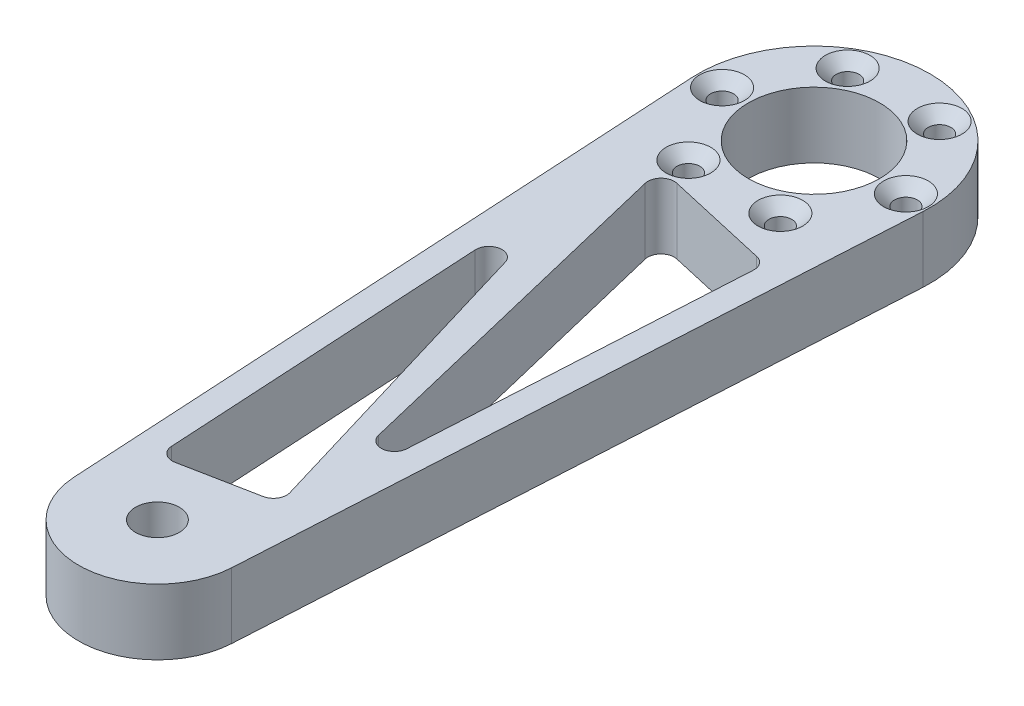
ISO-10303-21;
HEADER;
FILE_DESCRIPTION(('STEP AP214'),'2;1');
FILE_NAME('part.step','',(''),(''),'','','');
FILE_SCHEMA(('AUTOMOTIVE_DESIGN { 1 0 10303 214 1 1 1 1 }'));
ENDSEC;
DATA;
#1=APPLICATION_CONTEXT('core data for automotive mechanical design processes');
#2=APPLICATION_PROTOCOL_DEFINITION('international standard','automotive_design',2000,#1);
#3=PRODUCT_CONTEXT('',#1,'mechanical');
#4=PRODUCT('Part','Part','',(#3));
#5=PRODUCT_RELATED_PRODUCT_CATEGORY('part','',(#4));
#6=PRODUCT_DEFINITION_FORMATION('','',#4);
#7=PRODUCT_DEFINITION_CONTEXT('part definition',#1,'design');
#8=PRODUCT_DEFINITION('design','',#6,#7);
#9=PRODUCT_DEFINITION_SHAPE('','',#8);
#10=(LENGTH_UNIT() NAMED_UNIT(*) SI_UNIT(.MILLI.,.METRE.));
#11=(NAMED_UNIT(*) PLANE_ANGLE_UNIT() SI_UNIT($,.RADIAN.));
#12=(NAMED_UNIT(*) SI_UNIT($,.STERADIAN.) SOLID_ANGLE_UNIT());
#13=UNCERTAINTY_MEASURE_WITH_UNIT(LENGTH_MEASURE(1.E-05),#10,'distance_accuracy_value','');
#14=(GEOMETRIC_REPRESENTATION_CONTEXT(3) GLOBAL_UNCERTAINTY_ASSIGNED_CONTEXT((#13)) GLOBAL_UNIT_ASSIGNED_CONTEXT((#10,
#11,#12)) REPRESENTATION_CONTEXT('',''));
#15=CARTESIAN_POINT('',(0.,0.,0.));
#16=DIRECTION('',(0.,0.,1.));
#17=DIRECTION('',(1.,0.,0.));
#18=AXIS2_PLACEMENT_3D('',#15,#16,#17);
#19=CARTESIAN_POINT('',(0.,15.,0.));
#20=DIRECTION('',(0.,1.,0.));
#21=DIRECTION('',(0.,0.,1.));
#22=AXIS2_PLACEMENT_3D('',#19,#20,#21);
#23=PLANE('',#22);
#24=CARTESIAN_POINT('',(-21.,15.,-150.));
#25=DIRECTION('',(0.,1.,0.));
#26=DIRECTION('',(0.,0.,1.));
#27=AXIS2_PLACEMENT_3D('',#24,#25,#26);
#28=CIRCLE('',#27,5.10000000000002);
#29=CARTESIAN_POINT('',(-21.,15.,-144.9));
#30=VERTEX_POINT('',#29);
#31=EDGE_CURVE('E257',#30,#30,#28,.F.);
#32=ORIENTED_EDGE('',*,*,#31,.T.);
#33=EDGE_LOOP('',(#32));
#34=FACE_BOUND('',#33,.T.);
#35=CARTESIAN_POINT('',(-10.4999999999998,15.,-131.813466520527));
#36=DIRECTION('',(0.,1.,0.));
#37=DIRECTION('',(0.,0.,1.));
#38=AXIS2_PLACEMENT_3D('',#35,#36,#37);
#39=CIRCLE('',#38,5.10000000000005);
#40=CARTESIAN_POINT('',(-10.4999999999998,15.,-126.713466520527));
#41=VERTEX_POINT('',#40);
#42=EDGE_CURVE('E254',#41,#41,#39,.F.);
#43=ORIENTED_EDGE('',*,*,#42,.T.);
#44=EDGE_LOOP('',(#43));
#45=FACE_BOUND('',#44,.T.);
#46=CARTESIAN_POINT('',(10.5000000000001,15.,-131.813466520527));
#47=DIRECTION('',(0.,1.,0.));
#48=DIRECTION('',(0.,0.,1.));
#49=AXIS2_PLACEMENT_3D('',#46,#47,#48);
#50=CIRCLE('',#49,5.10000000000005);
#51=CARTESIAN_POINT('',(10.5000000000001,15.,-126.713466520527));
#52=VERTEX_POINT('',#51);
#53=EDGE_CURVE('E251',#52,#52,#50,.F.);
#54=ORIENTED_EDGE('',*,*,#53,.T.);
#55=EDGE_LOOP('',(#54));
#56=FACE_BOUND('',#55,.T.);
#57=CARTESIAN_POINT('',(21.,15.,-150.));
#58=DIRECTION('',(0.,1.,0.));
#59=DIRECTION('',(0.,0.,1.));
#60=AXIS2_PLACEMENT_3D('',#57,#58,#59);
#61=CIRCLE('',#60,5.10000000000002);
#62=CARTESIAN_POINT('',(21.,15.,-144.9));
#63=VERTEX_POINT('',#62);
#64=EDGE_CURVE('E248',#63,#63,#61,.F.);
#65=ORIENTED_EDGE('',*,*,#64,.T.);
#66=EDGE_LOOP('',(#65));
#67=FACE_BOUND('',#66,.T.);
#68=CARTESIAN_POINT('',(10.4999999999998,15.,-168.186533479473));
#69=DIRECTION('',(0.,1.,0.));
#70=DIRECTION('',(0.,0.,1.));
#71=AXIS2_PLACEMENT_3D('',#68,#69,#70);
#72=CIRCLE('',#71,5.10000000000005);
#73=CARTESIAN_POINT('',(10.4999999999998,15.,-163.086533479473));
#74=VERTEX_POINT('',#73);
#75=EDGE_CURVE('E245',#74,#74,#72,.F.);
#76=ORIENTED_EDGE('',*,*,#75,.T.);
#77=EDGE_LOOP('',(#76));
#78=FACE_BOUND('',#77,.T.);
#79=CARTESIAN_POINT('',(-10.5000000000001,15.,-168.186533479473));
#80=DIRECTION('',(0.,1.,0.));
#81=DIRECTION('',(0.,0.,1.));
#82=AXIS2_PLACEMENT_3D('',#79,#80,#81);
#83=CIRCLE('',#82,5.10000000000002);
#84=CARTESIAN_POINT('',(-10.5000000000001,15.,-163.086533479473));
#85=VERTEX_POINT('',#84);
#86=EDGE_CURVE('E242',#85,#85,#83,.F.);
#87=ORIENTED_EDGE('',*,*,#86,.T.);
#88=EDGE_LOOP('',(#87));
#89=FACE_BOUND('',#88,.T.);
#90=CARTESIAN_POINT('',(0.,15.,0.));
#91=DIRECTION('',(0.,1.,0.));
#92=DIRECTION('',(0.,0.,1.));
#93=AXIS2_PLACEMENT_3D('',#90,#91,#92);
#94=CIRCLE('',#93,5.);
#95=CARTESIAN_POINT('',(0.,15.,5.));
#96=VERTEX_POINT('',#95);
#97=EDGE_CURVE('E440',#96,#96,#94,.T.);
#98=ORIENTED_EDGE('',*,*,#97,.F.);
#99=EDGE_LOOP('',(#98));
#100=FACE_BOUND('',#99,.T.);
#101=CARTESIAN_POINT('',(0.,15.,0.));
#102=DIRECTION('',(0.,1.,0.));
#103=DIRECTION('',(0.,0.,1.));
#104=AXIS2_PLACEMENT_3D('',#101,#102,#103);
#105=CIRCLE('',#104,18.);
#106=CARTESIAN_POINT('',(-17.971076762398,15.,1.02));
#107=VERTEX_POINT('',#106);
#108=CARTESIAN_POINT('',(17.971076762398,15.,1.02));
#109=VERTEX_POINT('',#108);
#110=EDGE_CURVE('E168',#107,#109,#105,.T.);
#111=ORIENTED_EDGE('',*,*,#110,.T.);
#112=DIRECTION('',(0.0566666666666667,0.,-0.998393153466553));
#113=VECTOR('',#112,1.);
#114=CARTESIAN_POINT('',(17.971076762398,15.,1.02));
#115=LINE('',#114,#113);
#116=CARTESIAN_POINT('',(26.4574185668637,15.,-148.498333333333));
#117=VERTEX_POINT('',#116);
#118=EDGE_CURVE('E157',#109,#117,#115,.T.);
#119=ORIENTED_EDGE('',*,*,#118,.T.);
#120=CARTESIAN_POINT('',(0.,15.,-150.));
#121=DIRECTION('',(0.,1.,0.));
#122=DIRECTION('',(0.,0.,-1.));
#123=AXIS2_PLACEMENT_3D('',#120,#121,#122);
#124=CIRCLE('',#123,26.5);
#125=CARTESIAN_POINT('',(-26.4574185668637,15.,-148.498333333333));
#126=VERTEX_POINT('',#125);
#127=EDGE_CURVE('E167',#117,#126,#124,.T.);
#128=ORIENTED_EDGE('',*,*,#127,.T.);
#129=DIRECTION('',(0.0566666666666667,0.,0.998393153466553));
#130=VECTOR('',#129,1.);
#131=CARTESIAN_POINT('',(-17.971076762398,15.,1.02));
#132=LINE('',#131,#130);
#133=EDGE_CURVE('E173',#126,#107,#132,.T.);
#134=ORIENTED_EDGE('',*,*,#133,.T.);
#135=EDGE_LOOP('',(#111,#119,#128,#134));
#136=FACE_BOUND('',#135,.T.);
#137=CARTESIAN_POINT('',(0.,15.,-150.));
#138=DIRECTION('',(0.,1.,0.));
#139=DIRECTION('',(0.,0.,1.));
#140=AXIS2_PLACEMENT_3D('',#137,#138,#139);
#141=CIRCLE('',#140,15.);
#142=CARTESIAN_POINT('',(0.,15.,-135.));
#143=VERTEX_POINT('',#142);
#144=EDGE_CURVE('E434',#143,#143,#141,.T.);
#145=ORIENTED_EDGE('',*,*,#144,.F.);
#146=EDGE_LOOP('',(#145));
#147=FACE_BOUND('',#146,.T.);
#148=DIRECTION('',(-0.286666756449605,0.,-0.958030360033889));
#149=VECTOR('',#148,1.);
#150=CARTESIAN_POINT('',(-18.5543851913669,15.,-115.139490738387));
#151=LINE('',#150,#149);
#152=CARTESIAN_POINT('',(9.76560528215196,15.,-20.4950645568282));
#153=VERTEX_POINT('',#152);
#154=CARTESIAN_POINT('',(-11.2390630531947,15.,-90.6919378076061));
#155=VERTEX_POINT('',#154);
#156=EDGE_CURVE('E419',#153,#155,#151,.T.);
#157=ORIENTED_EDGE('',*,*,#156,.F.);
#158=CARTESIAN_POINT('',(6.8915142020503,15.,-19.6350642874794));
#159=DIRECTION('',(0.,1.,0.));
#160=DIRECTION('',(0.,0.,1.));
#161=AXIS2_PLACEMENT_3D('',#158,#159,#160);
#162=CIRCLE('',#161,3.);
#163=CARTESIAN_POINT('',(7.47066200637673,15.,-16.6914970943031));
#164=VERTEX_POINT('',#163);
#165=EDGE_CURVE('E57',#153,#164,#162,.F.);
#166=ORIENTED_EDGE('',*,*,#165,.T.);
#167=DIRECTION('',(0.981189064392104,0.,-0.19304926810881));
#168=VECTOR('',#167,1.);
#169=CARTESIAN_POINT('',(10.7128519545465,15.,-17.3293990229714));
#170=LINE('',#169,#168);
#171=CARTESIAN_POINT('',(-9.3618110753663,15.,-13.3797025311371));
#172=VERTEX_POINT('',#171);
#173=EDGE_CURVE('E417',#172,#164,#170,.T.);
#174=ORIENTED_EDGE('',*,*,#173,.F.);
#175=CARTESIAN_POINT('',(-9.94095887969273,15.,-16.3232697243134));
#176=DIRECTION('',(0.,1.,0.));
#177=DIRECTION('',(0.,0.,1.));
#178=AXIS2_PLACEMENT_3D('',#175,#176,#177);
#179=CIRCLE('',#178,3.);
#180=CARTESIAN_POINT('',(-12.9361383400924,15.,-16.1532697243134));
#181=VERTEX_POINT('',#180);
#182=EDGE_CURVE('E230',#172,#181,#179,.F.);
#183=ORIENTED_EDGE('',*,*,#182,.T.);
#184=DIRECTION('',(0.0566666666666666,0.,0.998393153466553));
#185=VECTOR('',#184,1.);
#186=CARTESIAN_POINT('',(-12.7409809539486,15.,-12.7148497565296));
#187=LINE('',#186,#185);
#188=CARTESIAN_POINT('',(-17.108333593696,15.,-89.6619375382572));
#189=VERTEX_POINT('',#188);
#190=EDGE_CURVE('E423',#189,#181,#187,.T.);
#191=ORIENTED_EDGE('',*,*,#190,.F.);
#192=CARTESIAN_POINT('',(-14.1131541332963,15.,-89.8319375382572));
#193=DIRECTION('',(0.,1.,0.));
#194=DIRECTION('',(0.,0.,1.));
#195=AXIS2_PLACEMENT_3D('',#192,#193,#194);
#196=CIRCLE('',#195,3.);
#197=EDGE_CURVE('E226',#189,#155,#196,.F.);
#198=ORIENTED_EDGE('',*,*,#197,.T.);
#199=EDGE_LOOP('',(#157,#166,#174,#183,#191,#198));
#200=FACE_BOUND('',#199,.T.);
#201=DIRECTION('',(0.234668209936248,0.,0.972075527541619));
#202=VECTOR('',#201,1.);
#203=CARTESIAN_POINT('',(-12.,15.,-127.));
#204=LINE('',#203,#202);
#205=CARTESIAN_POINT('',(-10.8653488920019,15.,-122.299889257763));
#206=VERTEX_POINT('',#205);
#207=CARTESIAN_POINT('',(8.52161939319863,15.,-41.992473829023));
#208=VERTEX_POINT('',#207);
#209=EDGE_CURVE('E402',#206,#208,#204,.T.);
#210=ORIENTED_EDGE('',*,*,#209,.F.);
#211=CARTESIAN_POINT('',(-7.94912230937701,15.,-123.003893887571));
#212=DIRECTION('',(0.,1.,0.));
#213=DIRECTION('',(0.,0.,1.));
#214=AXIS2_PLACEMENT_3D('',#211,#212,#213);
#215=CIRCLE('',#214,3.);
#216=CARTESIAN_POINT('',(-7.28487950298156,15.,-125.929433409463));
#217=VERTEX_POINT('',#216);
#218=EDGE_CURVE('E222',#206,#217,#215,.F.);
#219=ORIENTED_EDGE('',*,*,#218,.T.);
#220=DIRECTION('',(-0.975179840630658,0.,-0.221414268798477));
#221=VECTOR('',#220,1.);
#222=CARTESIAN_POINT('',(18.8302573337206,15.,-120.));
#223=LINE('',#222,#221);
#224=CARTESIAN_POINT('',(16.3555160897141,15.,-120.561889202563));
#225=VERTEX_POINT('',#224);
#226=EDGE_CURVE('E399',#225,#217,#223,.T.);
#227=ORIENTED_EDGE('',*,*,#226,.F.);
#228=CARTESIAN_POINT('',(15.6912732833187,15.,-117.636349680671));
#229=DIRECTION('',(0.,1.,0.));
#230=DIRECTION('',(0.,0.,1.));
#231=AXIS2_PLACEMENT_3D('',#228,#229,#230);
#232=CIRCLE('',#231,3.);
#233=CARTESIAN_POINT('',(18.6864527437183,15.,-117.466349680671));
#234=VERTEX_POINT('',#233);
#235=EDGE_CURVE('E218',#225,#234,#232,.F.);
#236=ORIENTED_EDGE('',*,*,#235,.T.);
#237=DIRECTION('',(0.0566666666666667,0.,-0.998393153466553));
#238=VECTOR('',#237,1.);
#239=CARTESIAN_POINT('',(13.2832157063432,15.,-22.2683226570439));
#240=LINE('',#239,#238);
#241=CARTESIAN_POINT('',(14.4330254362231,15.,-42.5264784588318));
#242=VERTEX_POINT('',#241);
#243=EDGE_CURVE('E406',#242,#234,#240,.T.);
#244=ORIENTED_EDGE('',*,*,#243,.F.);
#245=CARTESIAN_POINT('',(11.4378459758235,15.,-42.6964784588318));
#246=DIRECTION('',(0.,1.,0.));
#247=DIRECTION('',(0.,0.,1.));
#248=AXIS2_PLACEMENT_3D('',#245,#246,#247);
#249=CIRCLE('',#248,3.);
#250=EDGE_CURVE('E234',#242,#208,#249,.F.);
#251=ORIENTED_EDGE('',*,*,#250,.T.);
#252=EDGE_LOOP('',(#210,#219,#227,#236,#244,#251));
#253=FACE_BOUND('',#252,.T.);
#254=ADVANCED_FACE('F41',(#34,#45,#56,#67,#78,#89,#100,#136,#147,#200,#253),#23,.T.);
#255=CARTESIAN_POINT('',(0.,0.,0.));
#256=DIRECTION('',(0.,1.,0.));
#257=DIRECTION('',(0.,0.,1.));
#258=AXIS2_PLACEMENT_3D('',#255,#256,#257);
#259=PLANE('',#258);
#260=CARTESIAN_POINT('',(-10.5000000000001,0.,-168.186533479473));
#261=DIRECTION('',(0.,1.,0.));
#262=DIRECTION('',(0.866025403784436,0.,-0.500000000000004));
#263=AXIS2_PLACEMENT_3D('',#260,#261,#262);
#264=CIRCLE('',#263,2.6);
#265=CARTESIAN_POINT('',(-8.24833395016056,0.,-169.486533479473));
#266=VERTEX_POINT('',#265);
#267=EDGE_CURVE('E390',#266,#266,#264,.T.);
#268=ORIENTED_EDGE('',*,*,#267,.T.);
#269=EDGE_LOOP('',(#268));
#270=FACE_BOUND('',#269,.T.);
#271=CARTESIAN_POINT('',(-10.4999999999998,0.,-131.813466520527));
#272=DIRECTION('',(0.,1.,0.));
#273=DIRECTION('',(-0.866025403784443,0.,-0.499999999999992));
#274=AXIS2_PLACEMENT_3D('',#271,#272,#273);
#275=CIRCLE('',#274,2.6);
#276=CARTESIAN_POINT('',(-12.7516660498394,0.,-133.113466520527));
#277=VERTEX_POINT('',#276);
#278=EDGE_CURVE('E393',#277,#277,#275,.T.);
#279=ORIENTED_EDGE('',*,*,#278,.T.);
#280=EDGE_LOOP('',(#279));
#281=FACE_BOUND('',#280,.T.);
#282=CARTESIAN_POINT('',(10.5000000000001,0.,-131.813466520527));
#283=DIRECTION('',(0.,1.,0.));
#284=DIRECTION('',(0.866025403784436,0.,-0.500000000000004));
#285=AXIS2_PLACEMENT_3D('',#282,#283,#284);
#286=CIRCLE('',#285,2.6);
#287=CARTESIAN_POINT('',(12.7516660498396,0.,-133.113466520527));
#288=VERTEX_POINT('',#287);
#289=EDGE_CURVE('E381',#288,#288,#286,.T.);
#290=ORIENTED_EDGE('',*,*,#289,.T.);
#291=EDGE_LOOP('',(#290));
#292=FACE_BOUND('',#291,.T.);
#293=CARTESIAN_POINT('',(10.4999999999998,0.,-168.186533479473));
#294=DIRECTION('',(0.,1.,0.));
#295=DIRECTION('',(-0.866025403784443,0.,-0.499999999999992));
#296=AXIS2_PLACEMENT_3D('',#293,#294,#295);
#297=CIRCLE('',#296,2.6);
#298=CARTESIAN_POINT('',(8.24833395016029,0.,-169.486533479473));
#299=VERTEX_POINT('',#298);
#300=EDGE_CURVE('E384',#299,#299,#297,.T.);
#301=ORIENTED_EDGE('',*,*,#300,.T.);
#302=EDGE_LOOP('',(#301));
#303=FACE_BOUND('',#302,.T.);
#304=CARTESIAN_POINT('',(-21.,0.,-150.));
#305=DIRECTION('',(0.,1.,0.));
#306=DIRECTION('',(0.,0.,1.));
#307=AXIS2_PLACEMENT_3D('',#304,#305,#306);
#308=CIRCLE('',#307,2.6);
#309=CARTESIAN_POINT('',(-21.,0.,-147.4));
#310=VERTEX_POINT('',#309);
#311=EDGE_CURVE('E387',#310,#310,#308,.T.);
#312=ORIENTED_EDGE('',*,*,#311,.T.);
#313=EDGE_LOOP('',(#312));
#314=FACE_BOUND('',#313,.T.);
#315=CARTESIAN_POINT('',(21.,0.,-150.));
#316=DIRECTION('',(0.,1.,0.));
#317=DIRECTION('',(0.,0.,1.));
#318=AXIS2_PLACEMENT_3D('',#315,#316,#317);
#319=CIRCLE('',#318,2.6);
#320=CARTESIAN_POINT('',(21.,0.,-147.4));
#321=VERTEX_POINT('',#320);
#322=EDGE_CURVE('E383',#321,#321,#319,.T.);
#323=ORIENTED_EDGE('',*,*,#322,.T.);
#324=EDGE_LOOP('',(#323));
#325=FACE_BOUND('',#324,.T.);
#326=DIRECTION('',(0.0566666666666666,0.,0.998393153466553));
#327=VECTOR('',#326,1.);
#328=CARTESIAN_POINT('',(-12.7409809539486,0.,-12.7148497565296));
#329=LINE('',#328,#327);
#330=CARTESIAN_POINT('',(-17.108333593696,0.,-89.6619375382572));
#331=VERTEX_POINT('',#330);
#332=CARTESIAN_POINT('',(-12.9361383400924,0.,-16.1532697243134));
#333=VERTEX_POINT('',#332);
#334=EDGE_CURVE('E420',#331,#333,#329,.T.);
#335=ORIENTED_EDGE('',*,*,#334,.T.);
#336=CARTESIAN_POINT('',(-9.94095887969273,0.,-16.3232697243134));
#337=DIRECTION('',(0.,1.,0.));
#338=DIRECTION('',(0.,0.,1.));
#339=AXIS2_PLACEMENT_3D('',#336,#337,#338);
#340=CIRCLE('',#339,3.);
#341=CARTESIAN_POINT('',(-9.3618110753663,0.,-13.3797025311371));
#342=VERTEX_POINT('',#341);
#343=EDGE_CURVE('E228',#333,#342,#340,.T.);
#344=ORIENTED_EDGE('',*,*,#343,.T.);
#345=DIRECTION('',(0.981189064392104,0.,-0.19304926810881));
#346=VECTOR('',#345,1.);
#347=CARTESIAN_POINT('',(10.7128519545465,0.,-17.3293990229714));
#348=LINE('',#347,#346);
#349=CARTESIAN_POINT('',(7.47066200637673,0.,-16.6914970943031));
#350=VERTEX_POINT('',#349);
#351=EDGE_CURVE('E409',#342,#350,#348,.T.);
#352=ORIENTED_EDGE('',*,*,#351,.T.);
#353=CARTESIAN_POINT('',(6.8915142020503,0.,-19.6350642874794));
#354=DIRECTION('',(0.,1.,0.));
#355=DIRECTION('',(0.,0.,1.));
#356=AXIS2_PLACEMENT_3D('',#353,#354,#355);
#357=CIRCLE('',#356,3.);
#358=CARTESIAN_POINT('',(9.76560528215196,0.,-20.4950645568282));
#359=VERTEX_POINT('',#358);
#360=EDGE_CURVE('E236',#350,#359,#357,.T.);
#361=ORIENTED_EDGE('',*,*,#360,.T.);
#362=DIRECTION('',(-0.286666756449605,0.,-0.958030360033889));
#363=VECTOR('',#362,1.);
#364=CARTESIAN_POINT('',(-18.5543851913669,0.,-115.139490738387));
#365=LINE('',#364,#363);
#366=CARTESIAN_POINT('',(-11.2390630531947,0.,-90.6919378076061));
#367=VERTEX_POINT('',#366);
#368=EDGE_CURVE('E429',#359,#367,#365,.T.);
#369=ORIENTED_EDGE('',*,*,#368,.T.);
#370=CARTESIAN_POINT('',(-14.1131541332963,0.,-89.8319375382572));
#371=DIRECTION('',(0.,1.,0.));
#372=DIRECTION('',(0.,0.,1.));
#373=AXIS2_PLACEMENT_3D('',#370,#371,#372);
#374=CIRCLE('',#373,3.);
#375=EDGE_CURVE('E224',#367,#331,#374,.T.);
#376=ORIENTED_EDGE('',*,*,#375,.T.);
#377=EDGE_LOOP('',(#335,#344,#352,#361,#369,#376));
#378=FACE_BOUND('',#377,.T.);
#379=CARTESIAN_POINT('',(0.,0.,0.));
#380=DIRECTION('',(0.,1.,0.));
#381=DIRECTION('',(0.,0.,1.));
#382=AXIS2_PLACEMENT_3D('',#379,#380,#381);
#383=CIRCLE('',#382,18.);
#384=CARTESIAN_POINT('',(-17.971076762398,0.,1.02));
#385=VERTEX_POINT('',#384);
#386=CARTESIAN_POINT('',(17.971076762398,0.,1.02));
#387=VERTEX_POINT('',#386);
#388=EDGE_CURVE('E181',#385,#387,#383,.T.);
#389=ORIENTED_EDGE('',*,*,#388,.F.);
#390=DIRECTION('',(0.0566666666666667,0.,0.998393153466553));
#391=VECTOR('',#390,1.);
#392=CARTESIAN_POINT('',(-17.971076762398,0.,1.02));
#393=LINE('',#392,#391);
#394=CARTESIAN_POINT('',(-26.4574185668637,0.,-148.498333333333));
#395=VERTEX_POINT('',#394);
#396=EDGE_CURVE('E177',#395,#385,#393,.T.);
#397=ORIENTED_EDGE('',*,*,#396,.F.);
#398=CARTESIAN_POINT('',(0.,0.,-150.));
#399=DIRECTION('',(0.,1.,0.));
#400=DIRECTION('',(0.,0.,-1.));
#401=AXIS2_PLACEMENT_3D('',#398,#399,#400);
#402=CIRCLE('',#401,26.5);
#403=CARTESIAN_POINT('',(26.4574185668637,0.,-148.498333333333));
#404=VERTEX_POINT('',#403);
#405=EDGE_CURVE('E451',#404,#395,#402,.T.);
#406=ORIENTED_EDGE('',*,*,#405,.F.);
#407=DIRECTION('',(0.0566666666666667,0.,-0.998393153466553));
#408=VECTOR('',#407,1.);
#409=CARTESIAN_POINT('',(17.971076762398,0.,1.02));
#410=LINE('',#409,#408);
#411=EDGE_CURVE('E449',#387,#404,#410,.T.);
#412=ORIENTED_EDGE('',*,*,#411,.F.);
#413=EDGE_LOOP('',(#389,#397,#406,#412));
#414=FACE_BOUND('',#413,.T.);
#415=CARTESIAN_POINT('',(0.,0.,0.));
#416=DIRECTION('',(0.,1.,0.));
#417=DIRECTION('',(0.,0.,1.));
#418=AXIS2_PLACEMENT_3D('',#415,#416,#417);
#419=CIRCLE('',#418,5.);
#420=CARTESIAN_POINT('',(0.,0.,5.));
#421=VERTEX_POINT('',#420);
#422=EDGE_CURVE('E437',#421,#421,#419,.T.);
#423=ORIENTED_EDGE('',*,*,#422,.T.);
#424=EDGE_LOOP('',(#423));
#425=FACE_BOUND('',#424,.T.);
#426=CARTESIAN_POINT('',(0.,0.,-150.));
#427=DIRECTION('',(0.,1.,0.));
#428=DIRECTION('',(0.,0.,1.));
#429=AXIS2_PLACEMENT_3D('',#426,#427,#428);
#430=CIRCLE('',#429,15.);
#431=CARTESIAN_POINT('',(0.,0.,-135.));
#432=VERTEX_POINT('',#431);
#433=EDGE_CURVE('E426',#432,#432,#430,.T.);
#434=ORIENTED_EDGE('',*,*,#433,.T.);
#435=EDGE_LOOP('',(#434));
#436=FACE_BOUND('',#435,.T.);
#437=DIRECTION('',(0.0566666666666667,0.,-0.998393153466553));
#438=VECTOR('',#437,1.);
#439=CARTESIAN_POINT('',(13.2832157063432,0.,-22.2683226570439));
#440=LINE('',#439,#438);
#441=CARTESIAN_POINT('',(14.4330254362231,0.,-42.5264784588318));
#442=VERTEX_POINT('',#441);
#443=CARTESIAN_POINT('',(18.6864527437183,0.,-117.466349680671));
#444=VERTEX_POINT('',#443);
#445=EDGE_CURVE('E403',#442,#444,#440,.T.);
#446=ORIENTED_EDGE('',*,*,#445,.T.);
#447=CARTESIAN_POINT('',(15.6912732833187,0.,-117.636349680671));
#448=DIRECTION('',(0.,1.,0.));
#449=DIRECTION('',(0.,0.,1.));
#450=AXIS2_PLACEMENT_3D('',#447,#448,#449);
#451=CIRCLE('',#450,3.);
#452=CARTESIAN_POINT('',(16.3555160897141,0.,-120.561889202563));
#453=VERTEX_POINT('',#452);
#454=EDGE_CURVE('E216',#444,#453,#451,.T.);
#455=ORIENTED_EDGE('',*,*,#454,.T.);
#456=DIRECTION('',(-0.975179840630658,0.,-0.221414268798477));
#457=VECTOR('',#456,1.);
#458=CARTESIAN_POINT('',(18.8302573337206,0.,-120.));
#459=LINE('',#458,#457);
#460=CARTESIAN_POINT('',(-7.28487950298156,0.,-125.929433409463));
#461=VERTEX_POINT('',#460);
#462=EDGE_CURVE('E397',#453,#461,#459,.T.);
#463=ORIENTED_EDGE('',*,*,#462,.T.);
#464=CARTESIAN_POINT('',(-7.94912230937701,0.,-123.003893887571));
#465=DIRECTION('',(0.,1.,0.));
#466=DIRECTION('',(0.,0.,1.));
#467=AXIS2_PLACEMENT_3D('',#464,#465,#466);
#468=CIRCLE('',#467,3.);
#469=CARTESIAN_POINT('',(-10.8653488920019,0.,-122.299889257763));
#470=VERTEX_POINT('',#469);
#471=EDGE_CURVE('E220',#461,#470,#468,.T.);
#472=ORIENTED_EDGE('',*,*,#471,.T.);
#473=DIRECTION('',(0.234668209936248,0.,0.972075527541619));
#474=VECTOR('',#473,1.);
#475=CARTESIAN_POINT('',(-12.,0.,-127.));
#476=LINE('',#475,#474);
#477=CARTESIAN_POINT('',(8.52161939319863,0.,-41.992473829023));
#478=VERTEX_POINT('',#477);
#479=EDGE_CURVE('E412',#470,#478,#476,.T.);
#480=ORIENTED_EDGE('',*,*,#479,.T.);
#481=CARTESIAN_POINT('',(11.4378459758235,0.,-42.6964784588318));
#482=DIRECTION('',(0.,1.,0.));
#483=DIRECTION('',(0.,0.,1.));
#484=AXIS2_PLACEMENT_3D('',#481,#482,#483);
#485=CIRCLE('',#484,3.);
#486=EDGE_CURVE('E232',#478,#442,#485,.T.);
#487=ORIENTED_EDGE('',*,*,#486,.T.);
#488=EDGE_LOOP('',(#446,#455,#463,#472,#480,#487));
#489=FACE_BOUND('',#488,.T.);
#490=ADVANCED_FACE('F289',(#270,#281,#292,#303,#314,#325,#378,#414,#425,#436,#489),#259,.F.);
#491=CARTESIAN_POINT('',(0.,15.,0.));
#492=DIRECTION('',(0.,-1.,0.));
#493=DIRECTION('',(0.,0.,-1.));
#494=AXIS2_PLACEMENT_3D('',#491,#492,#493);
#495=CYLINDRICAL_SURFACE('',#494,18.);
#496=ORIENTED_EDGE('',*,*,#388,.T.);
#497=DIRECTION('',(0.,-1.,0.));
#498=VECTOR('',#497,1.);
#499=CARTESIAN_POINT('',(17.971076762398,15.,1.02));
#500=LINE('',#499,#498);
#501=EDGE_CURVE('E161',#109,#387,#500,.T.);
#502=ORIENTED_EDGE('',*,*,#501,.F.);
#503=ORIENTED_EDGE('',*,*,#110,.F.);
#504=DIRECTION('',(0.,-1.,0.));
#505=VECTOR('',#504,1.);
#506=CARTESIAN_POINT('',(-17.971076762398,15.,1.02));
#507=LINE('',#506,#505);
#508=EDGE_CURVE('E447',#107,#385,#507,.T.);
#509=ORIENTED_EDGE('',*,*,#508,.T.);
#510=EDGE_LOOP('',(#496,#502,#503,#509));
#511=FACE_BOUND('',#510,.T.);
#512=ADVANCED_FACE('F179',(#511),#495,.T.);
#513=CARTESIAN_POINT('',(17.971076762398,15.,1.02));
#514=DIRECTION('',(-0.998393153466554,0.,-0.0566666666666667));
#515=DIRECTION('',(-0.0566666666666667,0.,0.998393153466554));
#516=AXIS2_PLACEMENT_3D('',#513,#514,#515);
#517=PLANE('',#516);
#518=ORIENTED_EDGE('',*,*,#411,.T.);
#519=DIRECTION('',(0.,-1.,0.));
#520=VECTOR('',#519,1.);
#521=CARTESIAN_POINT('',(26.4574185668637,15.,-148.498333333333));
#522=LINE('',#521,#520);
#523=EDGE_CURVE('E164',#117,#404,#522,.T.);
#524=ORIENTED_EDGE('',*,*,#523,.F.);
#525=ORIENTED_EDGE('',*,*,#118,.F.);
#526=ORIENTED_EDGE('',*,*,#501,.T.);
#527=EDGE_LOOP('',(#518,#524,#525,#526));
#528=FACE_BOUND('',#527,.T.);
#529=ADVANCED_FACE('F159',(#528),#517,.F.);
#530=CARTESIAN_POINT('',(0.,15.,-150.));
#531=DIRECTION('',(0.,-1.,0.));
#532=DIRECTION('',(0.,0.,-1.));
#533=AXIS2_PLACEMENT_3D('',#530,#531,#532);
#534=CYLINDRICAL_SURFACE('',#533,26.5);
#535=ORIENTED_EDGE('',*,*,#405,.T.);
#536=DIRECTION('',(0.,-1.,0.));
#537=VECTOR('',#536,1.);
#538=CARTESIAN_POINT('',(-26.4574185668637,15.,-148.498333333333));
#539=LINE('',#538,#537);
#540=EDGE_CURVE('E186',#126,#395,#539,.T.);
#541=ORIENTED_EDGE('',*,*,#540,.F.);
#542=ORIENTED_EDGE('',*,*,#127,.F.);
#543=ORIENTED_EDGE('',*,*,#523,.T.);
#544=EDGE_LOOP('',(#535,#541,#542,#543));
#545=FACE_BOUND('',#544,.T.);
#546=ADVANCED_FACE('F306',(#545),#534,.T.);
#547=CARTESIAN_POINT('',(-17.971076762398,15.,1.02));
#548=DIRECTION('',(0.998393153466554,0.,-0.0566666666666667));
#549=DIRECTION('',(-0.0566666666666667,0.,-0.998393153466554));
#550=AXIS2_PLACEMENT_3D('',#547,#548,#549);
#551=PLANE('',#550);
#552=ORIENTED_EDGE('',*,*,#396,.T.);
#553=ORIENTED_EDGE('',*,*,#508,.F.);
#554=ORIENTED_EDGE('',*,*,#133,.F.);
#555=ORIENTED_EDGE('',*,*,#540,.T.);
#556=EDGE_LOOP('',(#552,#553,#554,#555));
#557=FACE_BOUND('',#556,.T.);
#558=ADVANCED_FACE('F303',(#557),#551,.F.);
#559=CARTESIAN_POINT('',(0.,15.,0.));
#560=DIRECTION('',(0.,-1.,0.));
#561=DIRECTION('',(0.,0.,-1.));
#562=AXIS2_PLACEMENT_3D('',#559,#560,#561);
#563=CYLINDRICAL_SURFACE('',#562,5.);
#564=ORIENTED_EDGE('',*,*,#97,.T.);
#565=EDGE_LOOP('',(#564));
#566=FACE_BOUND('',#565,.T.);
#567=ORIENTED_EDGE('',*,*,#422,.F.);
#568=EDGE_LOOP('',(#567));
#569=FACE_BOUND('',#568,.T.);
#570=ADVANCED_FACE('F300',(#566,#569),#563,.F.);
#571=CARTESIAN_POINT('',(0.,15.,-150.));
#572=DIRECTION('',(0.,-1.,0.));
#573=DIRECTION('',(0.,0.,-1.));
#574=AXIS2_PLACEMENT_3D('',#571,#572,#573);
#575=CYLINDRICAL_SURFACE('',#574,15.);
#576=ORIENTED_EDGE('',*,*,#144,.T.);
#577=EDGE_LOOP('',(#576));
#578=FACE_BOUND('',#577,.T.);
#579=ORIENTED_EDGE('',*,*,#433,.F.);
#580=EDGE_LOOP('',(#579));
#581=FACE_BOUND('',#580,.T.);
#582=ADVANCED_FACE('F503',(#578,#581),#575,.F.);
#583=CARTESIAN_POINT('',(10.7128519545465,15.,-17.3293990229714));
#584=DIRECTION('',(-0.19304926810881,0.,-0.981189064392104));
#585=DIRECTION('',(-0.981189064392104,0.,0.19304926810881));
#586=AXIS2_PLACEMENT_3D('',#583,#584,#585);
#587=PLANE('',#586);
#588=ORIENTED_EDGE('',*,*,#351,.F.);
#589=DIRECTION('',(0.,-1.,0.));
#590=VECTOR('',#589,1.);
#591=CARTESIAN_POINT('',(-9.3618110753663,15.,-13.3797025311371));
#592=LINE('',#591,#590);
#593=EDGE_CURVE('E64',#342,#172,#592,.F.);
#594=ORIENTED_EDGE('',*,*,#593,.T.);
#595=ORIENTED_EDGE('',*,*,#173,.T.);
#596=DIRECTION('',(0.,-1.,0.));
#597=VECTOR('',#596,1.);
#598=CARTESIAN_POINT('',(7.47066200637673,0.,-16.6914970943031));
#599=LINE('',#598,#597);
#600=EDGE_CURVE('E212',#164,#350,#599,.T.);
#601=ORIENTED_EDGE('',*,*,#600,.T.);
#602=EDGE_LOOP('',(#588,#594,#595,#601));
#603=FACE_BOUND('',#602,.T.);
#604=ADVANCED_FACE('F500',(#603),#587,.T.);
#605=CARTESIAN_POINT('',(-18.5543851913669,15.,-115.139490738387));
#606=DIRECTION('',(-0.958030360033889,0.,0.286666756449605));
#607=DIRECTION('',(0.286666756449605,0.,0.958030360033889));
#608=AXIS2_PLACEMENT_3D('',#605,#606,#607);
#609=PLANE('',#608);
#610=ORIENTED_EDGE('',*,*,#156,.T.);
#611=DIRECTION('',(0.,-1.,0.));
#612=VECTOR('',#611,1.);
#613=CARTESIAN_POINT('',(-11.2390630531947,0.,-90.6919378076061));
#614=LINE('',#613,#612);
#615=EDGE_CURVE('E204',#155,#367,#614,.T.);
#616=ORIENTED_EDGE('',*,*,#615,.T.);
#617=ORIENTED_EDGE('',*,*,#368,.F.);
#618=DIRECTION('',(0.,-1.,0.));
#619=VECTOR('',#618,1.);
#620=CARTESIAN_POINT('',(9.76560528215196,15.,-20.4950645568282));
#621=LINE('',#620,#619);
#622=EDGE_CURVE('E202',#359,#153,#621,.F.);
#623=ORIENTED_EDGE('',*,*,#622,.T.);
#624=EDGE_LOOP('',(#610,#616,#617,#623));
#625=FACE_BOUND('',#624,.T.);
#626=ADVANCED_FACE('F493',(#625),#609,.T.);
#627=CARTESIAN_POINT('',(-12.7409809539486,15.,-12.7148497565296));
#628=DIRECTION('',(0.998393153466553,0.,-0.0566666666666666));
#629=DIRECTION('',(-0.0566666666666666,0.,-0.998393153466553));
#630=AXIS2_PLACEMENT_3D('',#627,#628,#629);
#631=PLANE('',#630);
#632=ORIENTED_EDGE('',*,*,#334,.F.);
#633=DIRECTION('',(0.,-1.,0.));
#634=VECTOR('',#633,1.);
#635=CARTESIAN_POINT('',(-17.108333593696,15.,-89.6619375382572));
#636=LINE('',#635,#634);
#637=EDGE_CURVE('E210',#331,#189,#636,.F.);
#638=ORIENTED_EDGE('',*,*,#637,.T.);
#639=ORIENTED_EDGE('',*,*,#190,.T.);
#640=DIRECTION('',(0.,-1.,0.));
#641=VECTOR('',#640,1.);
#642=CARTESIAN_POINT('',(-12.9361383400924,0.,-16.1532697243134));
#643=LINE('',#642,#641);
#644=EDGE_CURVE('E207',#181,#333,#643,.T.);
#645=ORIENTED_EDGE('',*,*,#644,.T.);
#646=EDGE_LOOP('',(#632,#638,#639,#645));
#647=FACE_BOUND('',#646,.T.);
#648=ADVANCED_FACE('F486',(#647),#631,.T.);
#649=CARTESIAN_POINT('',(18.8302573337206,15.,-120.));
#650=DIRECTION('',(-0.221414268798477,0.,0.975179840630658));
#651=DIRECTION('',(0.975179840630658,0.,0.221414268798477));
#652=AXIS2_PLACEMENT_3D('',#649,#650,#651);
#653=PLANE('',#652);
#654=ORIENTED_EDGE('',*,*,#462,.F.);
#655=DIRECTION('',(0.,-1.,0.));
#656=VECTOR('',#655,1.);
#657=CARTESIAN_POINT('',(16.3555160897141,15.,-120.561889202563));
#658=LINE('',#657,#656);
#659=EDGE_CURVE('E195',#453,#225,#658,.F.);
#660=ORIENTED_EDGE('',*,*,#659,.T.);
#661=ORIENTED_EDGE('',*,*,#226,.T.);
#662=DIRECTION('',(0.,-1.,0.));
#663=VECTOR('',#662,1.);
#664=CARTESIAN_POINT('',(-7.28487950298158,0.,-125.929433409463));
#665=LINE('',#664,#663);
#666=EDGE_CURVE('E192',#217,#461,#665,.T.);
#667=ORIENTED_EDGE('',*,*,#666,.T.);
#668=EDGE_LOOP('',(#654,#660,#661,#667));
#669=FACE_BOUND('',#668,.T.);
#670=ADVANCED_FACE('F483',(#669),#653,.T.);
#671=CARTESIAN_POINT('',(-12.,15.,-127.));
#672=DIRECTION('',(0.972075527541619,0.,-0.234668209936247));
#673=DIRECTION('',(-0.234668209936248,0.,-0.972075527541619));
#674=AXIS2_PLACEMENT_3D('',#671,#672,#673);
#675=PLANE('',#674);
#676=ORIENTED_EDGE('',*,*,#479,.F.);
#677=DIRECTION('',(0.,-1.,0.));
#678=VECTOR('',#677,1.);
#679=CARTESIAN_POINT('',(-10.8653488920019,15.,-122.299889257763));
#680=LINE('',#679,#678);
#681=EDGE_CURVE('E200',#470,#206,#680,.F.);
#682=ORIENTED_EDGE('',*,*,#681,.T.);
#683=ORIENTED_EDGE('',*,*,#209,.T.);
#684=DIRECTION('',(0.,-1.,0.));
#685=VECTOR('',#684,1.);
#686=CARTESIAN_POINT('',(8.52161939319862,0.,-41.992473829023));
#687=LINE('',#686,#685);
#688=EDGE_CURVE('E197',#208,#478,#687,.T.);
#689=ORIENTED_EDGE('',*,*,#688,.T.);
#690=EDGE_LOOP('',(#676,#682,#683,#689));
#691=FACE_BOUND('',#690,.T.);
#692=ADVANCED_FACE('F477',(#691),#675,.T.);
#693=CARTESIAN_POINT('',(13.2832157063432,15.,-22.2683226570439));
#694=DIRECTION('',(-0.998393153466553,0.,-0.0566666666666667));
#695=DIRECTION('',(-0.0566666666666667,0.,0.998393153466553));
#696=AXIS2_PLACEMENT_3D('',#693,#694,#695);
#697=PLANE('',#696);
#698=ORIENTED_EDGE('',*,*,#243,.T.);
#699=DIRECTION('',(0.,-1.,0.));
#700=VECTOR('',#699,1.);
#701=CARTESIAN_POINT('',(18.6864527437183,0.,-117.466349680671));
#702=LINE('',#701,#700);
#703=EDGE_CURVE('E184',#234,#444,#702,.T.);
#704=ORIENTED_EDGE('',*,*,#703,.T.);
#705=ORIENTED_EDGE('',*,*,#445,.F.);
#706=DIRECTION('',(0.,-1.,0.));
#707=VECTOR('',#706,1.);
#708=CARTESIAN_POINT('',(14.4330254362231,15.,-42.5264784588318));
#709=LINE('',#708,#707);
#710=EDGE_CURVE('E182',#442,#242,#709,.F.);
#711=ORIENTED_EDGE('',*,*,#710,.T.);
#712=EDGE_LOOP('',(#698,#704,#705,#711));
#713=FACE_BOUND('',#712,.T.);
#714=ADVANCED_FACE('F319',(#713),#697,.T.);
#715=CARTESIAN_POINT('',(15.6912732833187,15.,-117.636349680671));
#716=DIRECTION('',(0.,1.,0.));
#717=DIRECTION('',(0.,0.,1.));
#718=AXIS2_PLACEMENT_3D('',#715,#716,#717);
#719=CYLINDRICAL_SURFACE('',#718,3.);
#720=ORIENTED_EDGE('',*,*,#235,.F.);
#721=ORIENTED_EDGE('',*,*,#659,.F.);
#722=ORIENTED_EDGE('',*,*,#454,.F.);
#723=ORIENTED_EDGE('',*,*,#703,.F.);
#724=EDGE_LOOP('',(#720,#721,#722,#723));
#725=FACE_BOUND('',#724,.T.);
#726=ADVANCED_FACE('F315',(#725),#719,.F.);
#727=CARTESIAN_POINT('',(-7.94912230937701,15.,-123.003893887571));
#728=DIRECTION('',(0.,1.,0.));
#729=DIRECTION('',(0.,0.,1.));
#730=AXIS2_PLACEMENT_3D('',#727,#728,#729);
#731=CYLINDRICAL_SURFACE('',#730,3.);
#732=ORIENTED_EDGE('',*,*,#218,.F.);
#733=ORIENTED_EDGE('',*,*,#681,.F.);
#734=ORIENTED_EDGE('',*,*,#471,.F.);
#735=ORIENTED_EDGE('',*,*,#666,.F.);
#736=EDGE_LOOP('',(#732,#733,#734,#735));
#737=FACE_BOUND('',#736,.T.);
#738=ADVANCED_FACE('F318',(#737),#731,.F.);
#739=CARTESIAN_POINT('',(-14.1131541332963,15.,-89.8319375382572));
#740=DIRECTION('',(0.,1.,0.));
#741=DIRECTION('',(0.,0.,1.));
#742=AXIS2_PLACEMENT_3D('',#739,#740,#741);
#743=CYLINDRICAL_SURFACE('',#742,3.);
#744=ORIENTED_EDGE('',*,*,#197,.F.);
#745=ORIENTED_EDGE('',*,*,#637,.F.);
#746=ORIENTED_EDGE('',*,*,#375,.F.);
#747=ORIENTED_EDGE('',*,*,#615,.F.);
#748=EDGE_LOOP('',(#744,#745,#746,#747));
#749=FACE_BOUND('',#748,.T.);
#750=ADVANCED_FACE('F323',(#749),#743,.F.);
#751=CARTESIAN_POINT('',(-9.94095887969273,15.,-16.3232697243134));
#752=DIRECTION('',(0.,1.,0.));
#753=DIRECTION('',(0.,0.,1.));
#754=AXIS2_PLACEMENT_3D('',#751,#752,#753);
#755=CYLINDRICAL_SURFACE('',#754,3.);
#756=ORIENTED_EDGE('',*,*,#182,.F.);
#757=ORIENTED_EDGE('',*,*,#593,.F.);
#758=ORIENTED_EDGE('',*,*,#343,.F.);
#759=ORIENTED_EDGE('',*,*,#644,.F.);
#760=EDGE_LOOP('',(#756,#757,#758,#759));
#761=FACE_BOUND('',#760,.T.);
#762=ADVANCED_FACE('F327',(#761),#755,.F.);
#763=CARTESIAN_POINT('',(11.4378459758235,15.,-42.6964784588318));
#764=DIRECTION('',(0.,1.,0.));
#765=DIRECTION('',(0.,0.,1.));
#766=AXIS2_PLACEMENT_3D('',#763,#764,#765);
#767=CYLINDRICAL_SURFACE('',#766,3.);
#768=ORIENTED_EDGE('',*,*,#250,.F.);
#769=ORIENTED_EDGE('',*,*,#710,.F.);
#770=ORIENTED_EDGE('',*,*,#486,.F.);
#771=ORIENTED_EDGE('',*,*,#688,.F.);
#772=EDGE_LOOP('',(#768,#769,#770,#771));
#773=FACE_BOUND('',#772,.T.);
#774=ADVANCED_FACE('F331',(#773),#767,.F.);
#775=CARTESIAN_POINT('',(6.8915142020503,15.,-19.6350642874794));
#776=DIRECTION('',(0.,1.,0.));
#777=DIRECTION('',(0.,0.,1.));
#778=AXIS2_PLACEMENT_3D('',#775,#776,#777);
#779=CYLINDRICAL_SURFACE('',#778,3.);
#780=ORIENTED_EDGE('',*,*,#165,.F.);
#781=ORIENTED_EDGE('',*,*,#622,.F.);
#782=ORIENTED_EDGE('',*,*,#360,.F.);
#783=ORIENTED_EDGE('',*,*,#600,.F.);
#784=EDGE_LOOP('',(#780,#781,#782,#783));
#785=FACE_BOUND('',#784,.T.);
#786=ADVANCED_FACE('F335',(#785),#779,.F.);
#787=CARTESIAN_POINT('',(21.,0.,-150.));
#788=DIRECTION('',(0.,1.,0.));
#789=DIRECTION('',(0.,0.,1.));
#790=AXIS2_PLACEMENT_3D('',#787,#788,#789);
#791=CYLINDRICAL_SURFACE('',#790,2.6);
#792=CARTESIAN_POINT('',(21.,12.5,-150.));
#793=DIRECTION('',(0.,1.,0.));
#794=DIRECTION('',(0.,0.,1.));
#795=AXIS2_PLACEMENT_3D('',#792,#793,#794);
#796=CIRCLE('',#795,2.6);
#797=CARTESIAN_POINT('',(21.,12.5,-147.4));
#798=VERTEX_POINT('',#797);
#799=EDGE_CURVE('E266',#798,#798,#796,.T.);
#800=ORIENTED_EDGE('',*,*,#799,.T.);
#801=EDGE_LOOP('',(#800));
#802=FACE_BOUND('',#801,.T.);
#803=ORIENTED_EDGE('',*,*,#322,.F.);
#804=EDGE_LOOP('',(#803));
#805=FACE_BOUND('',#804,.T.);
#806=ADVANCED_FACE('F339',(#802,#805),#791,.F.);
#807=CARTESIAN_POINT('',(-21.,0.,-150.));
#808=DIRECTION('',(0.,1.,0.));
#809=DIRECTION('',(0.,0.,1.));
#810=AXIS2_PLACEMENT_3D('',#807,#808,#809);
#811=CYLINDRICAL_SURFACE('',#810,2.6);
#812=CARTESIAN_POINT('',(-21.,12.5,-150.));
#813=DIRECTION('',(0.,1.,0.));
#814=DIRECTION('',(0.,0.,1.));
#815=AXIS2_PLACEMENT_3D('',#812,#813,#814);
#816=CIRCLE('',#815,2.6);
#817=CARTESIAN_POINT('',(-21.,12.5,-147.4));
#818=VERTEX_POINT('',#817);
#819=EDGE_CURVE('E239',#818,#818,#816,.T.);
#820=ORIENTED_EDGE('',*,*,#819,.T.);
#821=EDGE_LOOP('',(#820));
#822=FACE_BOUND('',#821,.T.);
#823=ORIENTED_EDGE('',*,*,#311,.F.);
#824=EDGE_LOOP('',(#823));
#825=FACE_BOUND('',#824,.T.);
#826=ADVANCED_FACE('F604',(#822,#825),#811,.F.);
#827=CARTESIAN_POINT('',(10.4999999999998,0.,-168.186533479473));
#828=DIRECTION('',(0.,1.,0.));
#829=DIRECTION('',(-0.866025403784443,0.,-0.499999999999992));
#830=AXIS2_PLACEMENT_3D('',#827,#828,#829);
#831=CYLINDRICAL_SURFACE('',#830,2.6);
#832=CARTESIAN_POINT('',(10.4999999999998,12.5,-168.186533479473));
#833=DIRECTION('',(0.,1.,0.));
#834=DIRECTION('',(0.,0.,1.));
#835=AXIS2_PLACEMENT_3D('',#832,#833,#834);
#836=CIRCLE('',#835,2.6);
#837=CARTESIAN_POINT('',(10.4999999999998,12.5,-165.586533479473));
#838=VERTEX_POINT('',#837);
#839=EDGE_CURVE('E50',#838,#838,#836,.T.);
#840=ORIENTED_EDGE('',*,*,#839,.T.);
#841=EDGE_LOOP('',(#840));
#842=FACE_BOUND('',#841,.T.);
#843=ORIENTED_EDGE('',*,*,#300,.F.);
#844=EDGE_LOOP('',(#843));
#845=FACE_BOUND('',#844,.T.);
#846=ADVANCED_FACE('F271',(#842,#845),#831,.F.);
#847=CARTESIAN_POINT('',(10.5000000000001,0.,-131.813466520527));
#848=DIRECTION('',(0.,1.,0.));
#849=DIRECTION('',(0.866025403784436,0.,-0.500000000000004));
#850=AXIS2_PLACEMENT_3D('',#847,#848,#849);
#851=CYLINDRICAL_SURFACE('',#850,2.6);
#852=CARTESIAN_POINT('',(10.5000000000001,12.5,-131.813466520527));
#853=DIRECTION('',(0.,1.,0.));
#854=DIRECTION('',(0.,0.,1.));
#855=AXIS2_PLACEMENT_3D('',#852,#853,#854);
#856=CIRCLE('',#855,2.6);
#857=CARTESIAN_POINT('',(10.5000000000001,12.5,-129.213466520527));
#858=VERTEX_POINT('',#857);
#859=EDGE_CURVE('E263',#858,#858,#856,.T.);
#860=ORIENTED_EDGE('',*,*,#859,.T.);
#861=EDGE_LOOP('',(#860));
#862=FACE_BOUND('',#861,.T.);
#863=ORIENTED_EDGE('',*,*,#289,.F.);
#864=EDGE_LOOP('',(#863));
#865=FACE_BOUND('',#864,.T.);
#866=ADVANCED_FACE('F374',(#862,#865),#851,.F.);
#867=CARTESIAN_POINT('',(-10.4999999999998,0.,-131.813466520527));
#868=DIRECTION('',(0.,1.,0.));
#869=DIRECTION('',(-0.866025403784443,0.,-0.499999999999992));
#870=AXIS2_PLACEMENT_3D('',#867,#868,#869);
#871=CYLINDRICAL_SURFACE('',#870,2.6);
#872=CARTESIAN_POINT('',(-10.4999999999998,12.5,-131.813466520527));
#873=DIRECTION('',(0.,1.,0.));
#874=DIRECTION('',(0.,0.,1.));
#875=AXIS2_PLACEMENT_3D('',#872,#873,#874);
#876=CIRCLE('',#875,2.6);
#877=CARTESIAN_POINT('',(-10.4999999999998,12.5,-129.213466520527));
#878=VERTEX_POINT('',#877);
#879=EDGE_CURVE('E260',#878,#878,#876,.T.);
#880=ORIENTED_EDGE('',*,*,#879,.T.);
#881=EDGE_LOOP('',(#880));
#882=FACE_BOUND('',#881,.T.);
#883=ORIENTED_EDGE('',*,*,#278,.F.);
#884=EDGE_LOOP('',(#883));
#885=FACE_BOUND('',#884,.T.);
#886=ADVANCED_FACE('F377',(#882,#885),#871,.F.);
#887=CARTESIAN_POINT('',(-10.5000000000001,0.,-168.186533479473));
#888=DIRECTION('',(0.,1.,0.));
#889=DIRECTION('',(0.866025403784436,0.,-0.500000000000004));
#890=AXIS2_PLACEMENT_3D('',#887,#888,#889);
#891=CYLINDRICAL_SURFACE('',#890,2.6);
#892=CARTESIAN_POINT('',(-10.5000000000001,12.5,-168.186533479473));
#893=DIRECTION('',(0.,1.,0.));
#894=DIRECTION('',(0.,0.,1.));
#895=AXIS2_PLACEMENT_3D('',#892,#893,#894);
#896=CIRCLE('',#895,2.6);
#897=CARTESIAN_POINT('',(-10.5000000000001,12.5,-165.586533479473));
#898=VERTEX_POINT('',#897);
#899=EDGE_CURVE('E11',#898,#898,#896,.T.);
#900=ORIENTED_EDGE('',*,*,#899,.T.);
#901=EDGE_LOOP('',(#900));
#902=FACE_BOUND('',#901,.T.);
#903=ORIENTED_EDGE('',*,*,#267,.F.);
#904=EDGE_LOOP('',(#903));
#905=FACE_BOUND('',#904,.T.);
#906=ADVANCED_FACE('F349',(#902,#905),#891,.F.);
#907=CARTESIAN_POINT('',(-21.,12.5,-150.));
#908=DIRECTION('',(0.,1.,0.));
#909=DIRECTION('',(0.,0.,1.));
#910=AXIS2_PLACEMENT_3D('',#907,#908,#909);
#911=CONICAL_SURFACE('',#910,2.6,0.785398163397446);
#912=ORIENTED_EDGE('',*,*,#31,.F.);
#913=EDGE_LOOP('',(#912));
#914=FACE_BOUND('',#913,.T.);
#915=ORIENTED_EDGE('',*,*,#819,.F.);
#916=EDGE_LOOP('',(#915));
#917=FACE_BOUND('',#916,.T.);
#918=ADVANCED_FACE('F342',(#914,#917),#911,.F.);
#919=CARTESIAN_POINT('',(-10.4999999999998,12.5,-131.813466520527));
#920=DIRECTION('',(0.,1.,0.));
#921=DIRECTION('',(0.,0.,1.));
#922=AXIS2_PLACEMENT_3D('',#919,#920,#921);
#923=CONICAL_SURFACE('',#922,2.6,0.785398163397453);
#924=ORIENTED_EDGE('',*,*,#42,.F.);
#925=EDGE_LOOP('',(#924));
#926=FACE_BOUND('',#925,.T.);
#927=ORIENTED_EDGE('',*,*,#879,.F.);
#928=EDGE_LOOP('',(#927));
#929=FACE_BOUND('',#928,.T.);
#930=ADVANCED_FACE('F348',(#926,#929),#923,.F.);
#931=CARTESIAN_POINT('',(10.5000000000001,12.5,-131.813466520527));
#932=DIRECTION('',(0.,1.,0.));
#933=DIRECTION('',(0.,0.,1.));
#934=AXIS2_PLACEMENT_3D('',#931,#932,#933);
#935=CONICAL_SURFACE('',#934,2.6,0.785398163397452);
#936=ORIENTED_EDGE('',*,*,#53,.F.);
#937=EDGE_LOOP('',(#936));
#938=FACE_BOUND('',#937,.T.);
#939=ORIENTED_EDGE('',*,*,#859,.F.);
#940=EDGE_LOOP('',(#939));
#941=FACE_BOUND('',#940,.T.);
#942=ADVANCED_FACE('F283',(#938,#941),#935,.F.);
#943=CARTESIAN_POINT('',(21.,12.5,-150.));
#944=DIRECTION('',(0.,1.,0.));
#945=DIRECTION('',(0.,0.,1.));
#946=AXIS2_PLACEMENT_3D('',#943,#944,#945);
#947=CONICAL_SURFACE('',#946,2.6,0.785398163397446);
#948=ORIENTED_EDGE('',*,*,#64,.F.);
#949=EDGE_LOOP('',(#948));
#950=FACE_BOUND('',#949,.T.);
#951=ORIENTED_EDGE('',*,*,#799,.F.);
#952=EDGE_LOOP('',(#951));
#953=FACE_BOUND('',#952,.T.);
#954=ADVANCED_FACE('F276',(#950,#953),#947,.F.);
#955=CARTESIAN_POINT('',(10.4999999999998,12.5,-168.186533479473));
#956=DIRECTION('',(0.,1.,0.));
#957=DIRECTION('',(0.,0.,1.));
#958=AXIS2_PLACEMENT_3D('',#955,#956,#957);
#959=CONICAL_SURFACE('',#958,2.6,0.785398163397453);
#960=ORIENTED_EDGE('',*,*,#75,.F.);
#961=EDGE_LOOP('',(#960));
#962=FACE_BOUND('',#961,.T.);
#963=ORIENTED_EDGE('',*,*,#839,.F.);
#964=EDGE_LOOP('',(#963));
#965=FACE_BOUND('',#964,.T.);
#966=ADVANCED_FACE('F274',(#962,#965),#959,.F.);
#967=CARTESIAN_POINT('',(-10.5000000000001,12.5,-168.186533479473));
#968=DIRECTION('',(0.,1.,0.));
#969=DIRECTION('',(0.,0.,1.));
#970=AXIS2_PLACEMENT_3D('',#967,#968,#969);
#971=CONICAL_SURFACE('',#970,2.6,0.785398163397446);
#972=ORIENTED_EDGE('',*,*,#86,.F.);
#973=EDGE_LOOP('',(#972));
#974=FACE_BOUND('',#973,.T.);
#975=ORIENTED_EDGE('',*,*,#899,.F.);
#976=EDGE_LOOP('',(#975));
#977=FACE_BOUND('',#976,.T.);
#978=ADVANCED_FACE('F44',(#974,#977),#971,.F.);
#979=CLOSED_SHELL('',(#254,#490,#512,#529,#546,#558,#570,#582,#604,#626,#648,#670,#692,#714,
#726,#738,#750,#762,#774,#786,#806,#826,#846,#866,#886,#906,#918,#930,#942,#954,#966,#978));
#980=MANIFOLD_SOLID_BREP('B2',#979);
#981=ADVANCED_BREP_SHAPE_REPRESENTATION('',(#18,#980),#14);
#982=SHAPE_DEFINITION_REPRESENTATION(#9,#981);
ENDSEC;
END-ISO-10303-21;
